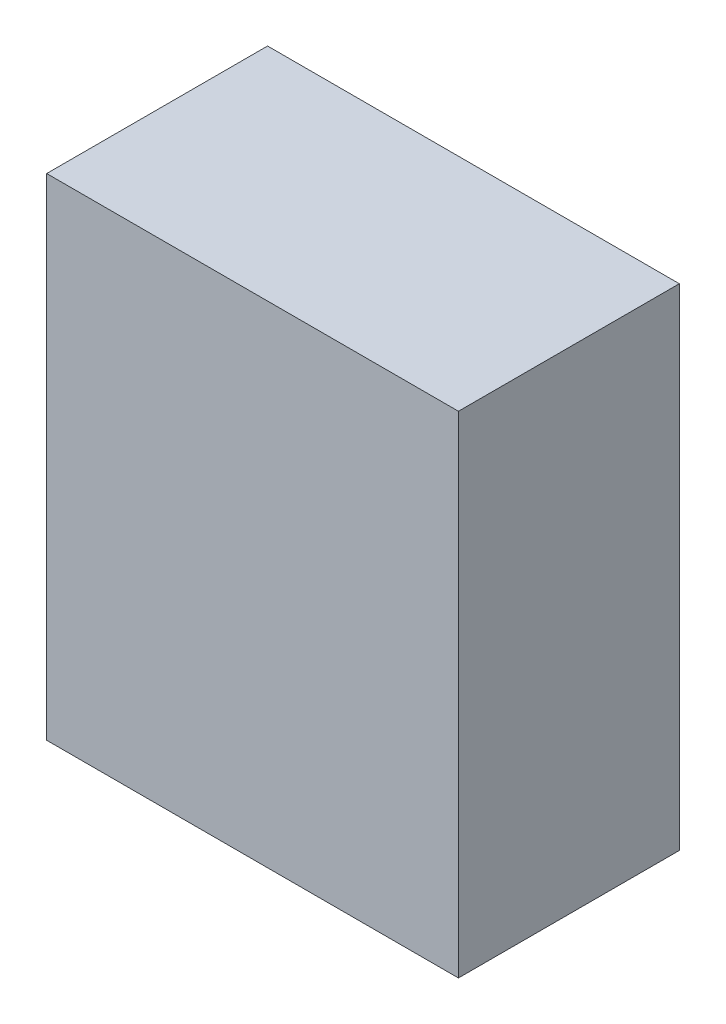
ISO-10303-21;
HEADER;
FILE_DESCRIPTION(('STEP AP214'),'2;1');
FILE_NAME('part.step','',(''),(''),'','','');
FILE_SCHEMA(('AUTOMOTIVE_DESIGN { 1 0 10303 214 1 1 1 1 }'));
ENDSEC;
DATA;
#1=APPLICATION_CONTEXT('core data for automotive mechanical design processes');
#2=APPLICATION_PROTOCOL_DEFINITION('international standard','automotive_design',2000,#1);
#3=PRODUCT_CONTEXT('',#1,'mechanical');
#4=PRODUCT('Part','Part','',(#3));
#5=PRODUCT_RELATED_PRODUCT_CATEGORY('part','',(#4));
#6=PRODUCT_DEFINITION_FORMATION('','',#4);
#7=PRODUCT_DEFINITION_CONTEXT('part definition',#1,'design');
#8=PRODUCT_DEFINITION('design','',#6,#7);
#9=PRODUCT_DEFINITION_SHAPE('','',#8);
#10=(LENGTH_UNIT() NAMED_UNIT(*) SI_UNIT(.MILLI.,.METRE.));
#11=(NAMED_UNIT(*) PLANE_ANGLE_UNIT() SI_UNIT($,.RADIAN.));
#12=(NAMED_UNIT(*) SI_UNIT($,.STERADIAN.) SOLID_ANGLE_UNIT());
#13=UNCERTAINTY_MEASURE_WITH_UNIT(LENGTH_MEASURE(1.E-05),#10,'distance_accuracy_value','');
#14=(GEOMETRIC_REPRESENTATION_CONTEXT(3) GLOBAL_UNCERTAINTY_ASSIGNED_CONTEXT((#13)) GLOBAL_UNIT_ASSIGNED_CONTEXT((#10,
#11,#12)) REPRESENTATION_CONTEXT('',''));
#15=CARTESIAN_POINT('',(0.,0.,0.));
#16=DIRECTION('',(0.,0.,1.));
#17=DIRECTION('',(1.,0.,0.));
#18=AXIS2_PLACEMENT_3D('',#15,#16,#17);
#19=CARTESIAN_POINT('',(-7.55,-9.,8.1));
#20=DIRECTION('',(0.,0.,1.));
#21=DIRECTION('',(1.,0.,0.));
#22=AXIS2_PLACEMENT_3D('',#19,#20,#21);
#23=PLANE('',#22);
#24=DIRECTION('',(0.,1.,0.));
#25=VECTOR('',#24,1.);
#26=CARTESIAN_POINT('',(-7.55,-9.,8.1));
#27=LINE('',#26,#25);
#28=CARTESIAN_POINT('',(-7.55,-9.,8.1));
#29=VERTEX_POINT('',#28);
#30=CARTESIAN_POINT('',(-7.55,9.,8.1));
#31=VERTEX_POINT('',#30);
#32=EDGE_CURVE('E65',#29,#31,#27,.T.);
#33=ORIENTED_EDGE('',*,*,#32,.F.);
#34=DIRECTION('',(1.,0.,0.));
#35=VECTOR('',#34,1.);
#36=CARTESIAN_POINT('',(-7.55,-9.,8.1));
#37=LINE('',#36,#35);
#38=CARTESIAN_POINT('',(7.55,-9.,8.1));
#39=VERTEX_POINT('',#38);
#40=EDGE_CURVE('E18',#29,#39,#37,.T.);
#41=ORIENTED_EDGE('',*,*,#40,.T.);
#42=DIRECTION('',(0.,1.,0.));
#43=VECTOR('',#42,1.);
#44=CARTESIAN_POINT('',(7.55,-9.,8.1));
#45=LINE('',#44,#43);
#46=CARTESIAN_POINT('',(7.55,9.,8.1));
#47=VERTEX_POINT('',#46);
#48=EDGE_CURVE('E67',#39,#47,#45,.T.);
#49=ORIENTED_EDGE('',*,*,#48,.T.);
#50=DIRECTION('',(1.,0.,0.));
#51=VECTOR('',#50,1.);
#52=CARTESIAN_POINT('',(-7.55,9.,8.1));
#53=LINE('',#52,#51);
#54=EDGE_CURVE('E9',#31,#47,#53,.T.);
#55=ORIENTED_EDGE('',*,*,#54,.F.);
#56=EDGE_LOOP('',(#33,#41,#49,#55));
#57=FACE_BOUND('',#56,.T.);
#58=ADVANCED_FACE('F14',(#57),#23,.T.);
#59=CARTESIAN_POINT('',(-7.55,-9.,0.));
#60=DIRECTION('',(0.,0.,1.));
#61=DIRECTION('',(1.,0.,0.));
#62=AXIS2_PLACEMENT_3D('',#59,#60,#61);
#63=PLANE('',#62);
#64=DIRECTION('',(1.,0.,0.));
#65=VECTOR('',#64,1.);
#66=CARTESIAN_POINT('',(-7.55,9.,0.));
#67=LINE('',#66,#65);
#68=CARTESIAN_POINT('',(-7.55,9.,0.));
#69=VERTEX_POINT('',#68);
#70=CARTESIAN_POINT('',(7.55,9.,0.));
#71=VERTEX_POINT('',#70);
#72=EDGE_CURVE('E25',#69,#71,#67,.T.);
#73=ORIENTED_EDGE('',*,*,#72,.T.);
#74=DIRECTION('',(0.,1.,0.));
#75=VECTOR('',#74,1.);
#76=CARTESIAN_POINT('',(7.55,-9.,0.));
#77=LINE('',#76,#75);
#78=CARTESIAN_POINT('',(7.55,-9.,0.));
#79=VERTEX_POINT('',#78);
#80=EDGE_CURVE('E87',#79,#71,#77,.T.);
#81=ORIENTED_EDGE('',*,*,#80,.F.);
#82=DIRECTION('',(1.,0.,0.));
#83=VECTOR('',#82,1.);
#84=CARTESIAN_POINT('',(-7.55,-9.,0.));
#85=LINE('',#84,#83);
#86=CARTESIAN_POINT('',(-7.55,-9.,0.));
#87=VERTEX_POINT('',#86);
#88=EDGE_CURVE('E94',#87,#79,#85,.T.);
#89=ORIENTED_EDGE('',*,*,#88,.F.);
#90=DIRECTION('',(0.,1.,0.));
#91=VECTOR('',#90,1.);
#92=CARTESIAN_POINT('',(-7.55,-9.,0.));
#93=LINE('',#92,#91);
#94=EDGE_CURVE('E76',#87,#69,#93,.T.);
#95=ORIENTED_EDGE('',*,*,#94,.T.);
#96=EDGE_LOOP('',(#73,#81,#89,#95));
#97=FACE_BOUND('',#96,.T.);
#98=ADVANCED_FACE('F134',(#97),#63,.F.);
#99=CARTESIAN_POINT('',(-7.55,9.,0.));
#100=DIRECTION('',(0.,1.,0.));
#101=DIRECTION('',(1.,0.,0.));
#102=AXIS2_PLACEMENT_3D('',#99,#100,#101);
#103=PLANE('',#102);
#104=ORIENTED_EDGE('',*,*,#72,.F.);
#105=DIRECTION('',(0.,0.,1.));
#106=VECTOR('',#105,1.);
#107=CARTESIAN_POINT('',(-7.55,9.,0.));
#108=LINE('',#107,#106);
#109=EDGE_CURVE('E70',#69,#31,#108,.T.);
#110=ORIENTED_EDGE('',*,*,#109,.T.);
#111=ORIENTED_EDGE('',*,*,#54,.T.);
#112=DIRECTION('',(0.,0.,1.));
#113=VECTOR('',#112,1.);
#114=CARTESIAN_POINT('',(7.55,9.,0.));
#115=LINE('',#114,#113);
#116=EDGE_CURVE('E95',#71,#47,#115,.T.);
#117=ORIENTED_EDGE('',*,*,#116,.F.);
#118=EDGE_LOOP('',(#104,#110,#111,#117));
#119=FACE_BOUND('',#118,.T.);
#120=ADVANCED_FACE('F71',(#119),#103,.T.);
#121=CARTESIAN_POINT('',(-7.55,-9.,0.));
#122=DIRECTION('',(0.,1.,0.));
#123=DIRECTION('',(1.,0.,0.));
#124=AXIS2_PLACEMENT_3D('',#121,#122,#123);
#125=PLANE('',#124);
#126=DIRECTION('',(0.,0.,1.));
#127=VECTOR('',#126,1.);
#128=CARTESIAN_POINT('',(7.55,-9.,0.));
#129=LINE('',#128,#127);
#130=EDGE_CURVE('E92',#79,#39,#129,.T.);
#131=ORIENTED_EDGE('',*,*,#130,.T.);
#132=ORIENTED_EDGE('',*,*,#40,.F.);
#133=DIRECTION('',(0.,0.,1.));
#134=VECTOR('',#133,1.);
#135=CARTESIAN_POINT('',(-7.55,-9.,0.));
#136=LINE('',#135,#134);
#137=EDGE_CURVE('E80',#87,#29,#136,.T.);
#138=ORIENTED_EDGE('',*,*,#137,.F.);
#139=ORIENTED_EDGE('',*,*,#88,.T.);
#140=EDGE_LOOP('',(#131,#132,#138,#139));
#141=FACE_BOUND('',#140,.T.);
#142=ADVANCED_FACE('F124',(#141),#125,.F.);
#143=CARTESIAN_POINT('',(7.55,-9.,0.));
#144=DIRECTION('',(1.,0.,0.));
#145=DIRECTION('',(0.,1.,0.));
#146=AXIS2_PLACEMENT_3D('',#143,#144,#145);
#147=PLANE('',#146);
#148=ORIENTED_EDGE('',*,*,#130,.F.);
#149=ORIENTED_EDGE('',*,*,#80,.T.);
#150=ORIENTED_EDGE('',*,*,#116,.T.);
#151=ORIENTED_EDGE('',*,*,#48,.F.);
#152=EDGE_LOOP('',(#148,#149,#150,#151));
#153=FACE_BOUND('',#152,.T.);
#154=ADVANCED_FACE('F122',(#153),#147,.T.);
#155=CARTESIAN_POINT('',(-7.55,-9.,0.));
#156=DIRECTION('',(1.,0.,0.));
#157=DIRECTION('',(0.,1.,0.));
#158=AXIS2_PLACEMENT_3D('',#155,#156,#157);
#159=PLANE('',#158);
#160=ORIENTED_EDGE('',*,*,#32,.T.);
#161=ORIENTED_EDGE('',*,*,#109,.F.);
#162=ORIENTED_EDGE('',*,*,#94,.F.);
#163=ORIENTED_EDGE('',*,*,#137,.T.);
#164=EDGE_LOOP('',(#160,#161,#162,#163));
#165=FACE_BOUND('',#164,.T.);
#166=ADVANCED_FACE('F16',(#165),#159,.F.);
#167=CLOSED_SHELL('',(#58,#98,#120,#142,#154,#166));
#168=MANIFOLD_SOLID_BREP('B1',#167);
#169=ADVANCED_BREP_SHAPE_REPRESENTATION('',(#18,#168),#14);
#170=SHAPE_DEFINITION_REPRESENTATION(#9,#169);
ENDSEC;
END-ISO-10303-21;
